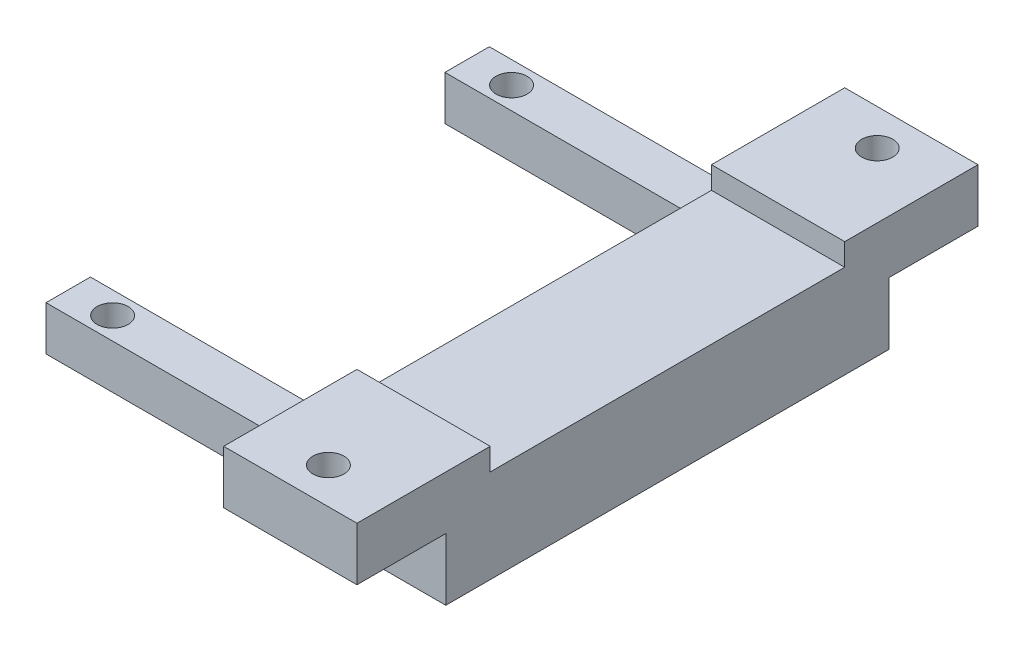
ISO-10303-21;
HEADER;
FILE_DESCRIPTION(('STEP AP214'),'2;1');
FILE_NAME('part.step','',(''),(''),'','','');
FILE_SCHEMA(('AUTOMOTIVE_DESIGN { 1 0 10303 214 1 1 1 1 }'));
ENDSEC;
DATA;
#1=APPLICATION_CONTEXT('core data for automotive mechanical design processes');
#2=APPLICATION_PROTOCOL_DEFINITION('international standard','automotive_design',2000,#1);
#3=PRODUCT_CONTEXT('',#1,'mechanical');
#4=PRODUCT('Part','Part','',(#3));
#5=PRODUCT_RELATED_PRODUCT_CATEGORY('part','',(#4));
#6=PRODUCT_DEFINITION_FORMATION('','',#4);
#7=PRODUCT_DEFINITION_CONTEXT('part definition',#1,'design');
#8=PRODUCT_DEFINITION('design','',#6,#7);
#9=PRODUCT_DEFINITION_SHAPE('','',#8);
#10=(LENGTH_UNIT() NAMED_UNIT(*) SI_UNIT(.MILLI.,.METRE.));
#11=(NAMED_UNIT(*) PLANE_ANGLE_UNIT() SI_UNIT($,.RADIAN.));
#12=(NAMED_UNIT(*) SI_UNIT($,.STERADIAN.) SOLID_ANGLE_UNIT());
#13=UNCERTAINTY_MEASURE_WITH_UNIT(LENGTH_MEASURE(1.E-05),#10,'distance_accuracy_value','');
#14=(GEOMETRIC_REPRESENTATION_CONTEXT(3) GLOBAL_UNCERTAINTY_ASSIGNED_CONTEXT((#13)) GLOBAL_UNIT_ASSIGNED_CONTEXT((#10,
#11,#12)) REPRESENTATION_CONTEXT('',''));
#15=CARTESIAN_POINT('',(0.,0.,0.));
#16=DIRECTION('',(0.,0.,1.));
#17=DIRECTION('',(1.,0.,0.));
#18=AXIS2_PLACEMENT_3D('',#15,#16,#17);
#19=CARTESIAN_POINT('',(0.,13.,0.));
#20=DIRECTION('',(0.,-1.,0.));
#21=DIRECTION('',(0.,0.,-1.));
#22=AXIS2_PLACEMENT_3D('',#19,#20,#21);
#23=PLANE('',#22);
#24=CARTESIAN_POINT('',(7.72256481687533,13.,-30.8856889982669));
#25=DIRECTION('',(0.,1.,0.));
#26=DIRECTION('',(0.,0.,1.));
#27=AXIS2_PLACEMENT_3D('',#24,#25,#26);
#28=CIRCLE('',#27,1.75);
#29=CARTESIAN_POINT('',(7.72256481687533,13.,-29.1356889982669));
#30=VERTEX_POINT('',#29);
#31=EDGE_CURVE('E239',#30,#30,#28,.T.);
#32=ORIENTED_EDGE('',*,*,#31,.F.);
#33=EDGE_LOOP('',(#32));
#34=FACE_BOUND('',#33,.T.);
#35=DIRECTION('',(0.,0.,1.));
#36=VECTOR('',#35,1.);
#37=CARTESIAN_POINT('',(0.,13.,24.95));
#38=LINE('',#37,#36);
#39=CARTESIAN_POINT('',(0.,13.,-34.95));
#40=VERTEX_POINT('',#39);
#41=CARTESIAN_POINT('',(0.,13.,-19.95));
#42=VERTEX_POINT('',#41);
#43=EDGE_CURVE('E269',#40,#42,#38,.T.);
#44=ORIENTED_EDGE('',*,*,#43,.T.);
#45=DIRECTION('',(-1.,0.,0.));
#46=VECTOR('',#45,1.);
#47=CARTESIAN_POINT('',(0.,13.,-19.95));
#48=LINE('',#47,#46);
#49=CARTESIAN_POINT('',(15.,13.,-19.95));
#50=VERTEX_POINT('',#49);
#51=EDGE_CURVE('E195',#50,#42,#48,.T.);
#52=ORIENTED_EDGE('',*,*,#51,.F.);
#53=DIRECTION('',(0.,0.,-1.));
#54=VECTOR('',#53,1.);
#55=CARTESIAN_POINT('',(15.,13.,24.95));
#56=LINE('',#55,#54);
#57=CARTESIAN_POINT('',(15.,13.,-34.95));
#58=VERTEX_POINT('',#57);
#59=EDGE_CURVE('E273',#50,#58,#56,.T.);
#60=ORIENTED_EDGE('',*,*,#59,.T.);
#61=DIRECTION('',(1.,0.,0.));
#62=VECTOR('',#61,1.);
#63=CARTESIAN_POINT('',(15.,13.,-34.95));
#64=LINE('',#63,#62);
#65=EDGE_CURVE('E255',#40,#58,#64,.T.);
#66=ORIENTED_EDGE('',*,*,#65,.F.);
#67=EDGE_LOOP('',(#44,#52,#60,#66));
#68=FACE_BOUND('',#67,.T.);
#69=ADVANCED_FACE('F45',(#34,#68),#23,.F.);
#70=CARTESIAN_POINT('',(0.,2.,-24.95));
#71=DIRECTION('',(0.,0.,1.));
#72=DIRECTION('',(1.,0.,0.));
#73=AXIS2_PLACEMENT_3D('',#70,#71,#72);
#74=PLANE('',#73);
#75=DIRECTION('',(-1.,0.,0.));
#76=VECTOR('',#75,1.);
#77=CARTESIAN_POINT('',(15.,7.,-24.95));
#78=LINE('',#77,#76);
#79=CARTESIAN_POINT('',(15.,7.,-24.95));
#80=VERTEX_POINT('',#79);
#81=CARTESIAN_POINT('',(0.,7.,-24.95));
#82=VERTEX_POINT('',#81);
#83=EDGE_CURVE('E71',#80,#82,#78,.T.);
#84=ORIENTED_EDGE('',*,*,#83,.F.);
#85=DIRECTION('',(0.,-1.,0.));
#86=VECTOR('',#85,1.);
#87=CARTESIAN_POINT('',(15.,2.,-24.95));
#88=LINE('',#87,#86);
#89=CARTESIAN_POINT('',(15.,0.,-24.95));
#90=VERTEX_POINT('',#89);
#91=EDGE_CURVE('E382',#80,#90,#88,.T.);
#92=ORIENTED_EDGE('',*,*,#91,.T.);
#93=DIRECTION('',(-1.,0.,0.));
#94=VECTOR('',#93,1.);
#95=CARTESIAN_POINT('',(0.,0.,-24.95));
#96=LINE('',#95,#94);
#97=CARTESIAN_POINT('',(0.,0.,-24.95));
#98=VERTEX_POINT('',#97);
#99=EDGE_CURVE('E376',#90,#98,#96,.T.);
#100=ORIENTED_EDGE('',*,*,#99,.T.);
#101=DIRECTION('',(0.,-1.,0.));
#102=VECTOR('',#101,1.);
#103=CARTESIAN_POINT('',(0.,2.,-24.95));
#104=LINE('',#103,#102);
#105=CARTESIAN_POINT('',(0.,2.,-24.95));
#106=VERTEX_POINT('',#105);
#107=EDGE_CURVE('E363',#106,#98,#104,.T.);
#108=ORIENTED_EDGE('',*,*,#107,.F.);
#109=DIRECTION('',(-1.,0.,0.));
#110=VECTOR('',#109,1.);
#111=CARTESIAN_POINT('',(15.,2.,-24.95));
#112=LINE('',#111,#110);
#113=CARTESIAN_POINT('',(-30.,2.,-24.95));
#114=VERTEX_POINT('',#113);
#115=EDGE_CURVE('E319',#106,#114,#112,.T.);
#116=ORIENTED_EDGE('',*,*,#115,.T.);
#117=DIRECTION('',(0.,-1.,0.));
#118=VECTOR('',#117,1.);
#119=CARTESIAN_POINT('',(-30.,7.,-24.95));
#120=LINE('',#119,#118);
#121=CARTESIAN_POINT('',(-30.,7.,-24.95));
#122=VERTEX_POINT('',#121);
#123=EDGE_CURVE('E333',#122,#114,#120,.T.);
#124=ORIENTED_EDGE('',*,*,#123,.F.);
#125=DIRECTION('',(-1.,0.,0.));
#126=VECTOR('',#125,1.);
#127=CARTESIAN_POINT('',(15.,7.,-24.95));
#128=LINE('',#127,#126);
#129=EDGE_CURVE('E347',#82,#122,#128,.T.);
#130=ORIENTED_EDGE('',*,*,#129,.F.);
#131=EDGE_LOOP('',(#84,#92,#100,#108,#116,#124,#130));
#132=FACE_BOUND('',#131,.T.);
#133=ADVANCED_FACE('F418',(#132),#74,.F.);
#134=CARTESIAN_POINT('',(15.,7.,-19.95));
#135=DIRECTION('',(0.,0.,-1.));
#136=DIRECTION('',(-1.,0.,0.));
#137=AXIS2_PLACEMENT_3D('',#134,#135,#136);
#138=PLANE('',#137);
#139=DIRECTION('',(0.,-1.,0.));
#140=VECTOR('',#139,1.);
#141=CARTESIAN_POINT('',(0.,7.,-19.95));
#142=LINE('',#141,#140);
#143=CARTESIAN_POINT('',(0.,7.,-19.95));
#144=VERTEX_POINT('',#143);
#145=CARTESIAN_POINT('',(0.,2.,-19.95));
#146=VERTEX_POINT('',#145);
#147=EDGE_CURVE('E282',#144,#146,#142,.T.);
#148=ORIENTED_EDGE('',*,*,#147,.F.);
#149=DIRECTION('',(1.,0.,0.));
#150=VECTOR('',#149,1.);
#151=CARTESIAN_POINT('',(15.,7.,-19.95));
#152=LINE('',#151,#150);
#153=CARTESIAN_POINT('',(-30.,7.,-19.95));
#154=VERTEX_POINT('',#153);
#155=EDGE_CURVE('E341',#154,#144,#152,.T.);
#156=ORIENTED_EDGE('',*,*,#155,.F.);
#157=DIRECTION('',(0.,-1.,0.));
#158=VECTOR('',#157,1.);
#159=CARTESIAN_POINT('',(-30.,7.,-19.95));
#160=LINE('',#159,#158);
#161=CARTESIAN_POINT('',(-30.,2.,-19.95));
#162=VERTEX_POINT('',#161);
#163=EDGE_CURVE('E337',#154,#162,#160,.T.);
#164=ORIENTED_EDGE('',*,*,#163,.T.);
#165=DIRECTION('',(1.,0.,0.));
#166=VECTOR('',#165,1.);
#167=CARTESIAN_POINT('',(15.,2.,-19.95));
#168=LINE('',#167,#166);
#169=EDGE_CURVE('E342',#162,#146,#168,.T.);
#170=ORIENTED_EDGE('',*,*,#169,.T.);
#171=EDGE_LOOP('',(#148,#156,#164,#170));
#172=FACE_BOUND('',#171,.T.);
#173=ADVANCED_FACE('F427',(#172),#138,.F.);
#174=CARTESIAN_POINT('',(0.,7.,0.));
#175=DIRECTION('',(0.,-1.,0.));
#176=DIRECTION('',(0.,0.,-1.));
#177=AXIS2_PLACEMENT_3D('',#174,#175,#176);
#178=PLANE('',#177);
#179=CARTESIAN_POINT('',(-25.,7.,-22.45));
#180=DIRECTION('',(0.,1.,0.));
#181=DIRECTION('',(0.,0.,-1.));
#182=AXIS2_PLACEMENT_3D('',#179,#180,#181);
#183=CIRCLE('',#182,1.75);
#184=CARTESIAN_POINT('',(-25.,7.,-24.2));
#185=VERTEX_POINT('',#184);
#186=EDGE_CURVE('E290',#185,#185,#183,.T.);
#187=ORIENTED_EDGE('',*,*,#186,.F.);
#188=EDGE_LOOP('',(#187));
#189=FACE_BOUND('',#188,.T.);
#190=DIRECTION('',(0.,0.,1.));
#191=VECTOR('',#190,1.);
#192=CARTESIAN_POINT('',(0.,7.,0.));
#193=LINE('',#192,#191);
#194=EDGE_CURVE('E286',#82,#144,#193,.T.);
#195=ORIENTED_EDGE('',*,*,#194,.F.);
#196=ORIENTED_EDGE('',*,*,#129,.T.);
#197=DIRECTION('',(0.,0.,1.));
#198=VECTOR('',#197,1.);
#199=CARTESIAN_POINT('',(-30.,7.,-24.95));
#200=LINE('',#199,#198);
#201=EDGE_CURVE('E355',#122,#154,#200,.T.);
#202=ORIENTED_EDGE('',*,*,#201,.T.);
#203=ORIENTED_EDGE('',*,*,#155,.T.);
#204=EDGE_LOOP('',(#195,#196,#202,#203));
#205=FACE_BOUND('',#204,.T.);
#206=ADVANCED_FACE('F479',(#189,#205),#178,.F.);
#207=CARTESIAN_POINT('',(15.,7.,19.95));
#208=DIRECTION('',(0.,0.,1.));
#209=DIRECTION('',(1.,0.,0.));
#210=AXIS2_PLACEMENT_3D('',#207,#208,#209);
#211=PLANE('',#210);
#212=DIRECTION('',(0.,1.,0.));
#213=VECTOR('',#212,1.);
#214=CARTESIAN_POINT('',(0.,7.,19.95));
#215=LINE('',#214,#213);
#216=CARTESIAN_POINT('',(0.,2.,19.95));
#217=VERTEX_POINT('',#216);
#218=CARTESIAN_POINT('',(0.,7.,19.95));
#219=VERTEX_POINT('',#218);
#220=EDGE_CURVE('E278',#217,#219,#215,.T.);
#221=ORIENTED_EDGE('',*,*,#220,.F.);
#222=DIRECTION('',(-1.,0.,0.));
#223=VECTOR('',#222,1.);
#224=CARTESIAN_POINT('',(15.,2.,19.95));
#225=LINE('',#224,#223);
#226=CARTESIAN_POINT('',(-30.,2.,19.95));
#227=VERTEX_POINT('',#226);
#228=EDGE_CURVE('E315',#217,#227,#225,.T.);
#229=ORIENTED_EDGE('',*,*,#228,.T.);
#230=DIRECTION('',(0.,-1.,0.));
#231=VECTOR('',#230,1.);
#232=CARTESIAN_POINT('',(-30.,7.,19.95));
#233=LINE('',#232,#231);
#234=CARTESIAN_POINT('',(-30.,7.,19.95));
#235=VERTEX_POINT('',#234);
#236=EDGE_CURVE('E328',#235,#227,#233,.T.);
#237=ORIENTED_EDGE('',*,*,#236,.F.);
#238=DIRECTION('',(-1.,0.,0.));
#239=VECTOR('',#238,1.);
#240=CARTESIAN_POINT('',(15.,7.,19.95));
#241=LINE('',#240,#239);
#242=EDGE_CURVE('E303',#219,#235,#241,.T.);
#243=ORIENTED_EDGE('',*,*,#242,.F.);
#244=EDGE_LOOP('',(#221,#229,#237,#243));
#245=FACE_BOUND('',#244,.T.);
#246=ADVANCED_FACE('F505',(#245),#211,.F.);
#247=CARTESIAN_POINT('',(0.,7.,0.));
#248=DIRECTION('',(0.,1.,0.));
#249=DIRECTION('',(0.,0.,1.));
#250=AXIS2_PLACEMENT_3D('',#247,#248,#249);
#251=PLANE('',#250);
#252=CARTESIAN_POINT('',(-25.,7.,22.45));
#253=DIRECTION('',(0.,1.,0.));
#254=DIRECTION('',(0.,0.,1.));
#255=AXIS2_PLACEMENT_3D('',#252,#253,#254);
#256=CIRCLE('',#255,1.75);
#257=CARTESIAN_POINT('',(-25.,7.,24.2));
#258=VERTEX_POINT('',#257);
#259=EDGE_CURVE('E291',#258,#258,#256,.T.);
#260=ORIENTED_EDGE('',*,*,#259,.F.);
#261=EDGE_LOOP('',(#260));
#262=FACE_BOUND('',#261,.T.);
#263=DIRECTION('',(1.,0.,0.));
#264=VECTOR('',#263,1.);
#265=CARTESIAN_POINT('',(15.,7.,24.95));
#266=LINE('',#265,#264);
#267=CARTESIAN_POINT('',(-30.,7.,24.95));
#268=VERTEX_POINT('',#267);
#269=CARTESIAN_POINT('',(0.,7.,24.95));
#270=VERTEX_POINT('',#269);
#271=EDGE_CURVE('E310',#268,#270,#266,.T.);
#272=ORIENTED_EDGE('',*,*,#271,.T.);
#273=DIRECTION('',(0.,0.,-1.));
#274=VECTOR('',#273,1.);
#275=CARTESIAN_POINT('',(0.,7.,0.));
#276=LINE('',#275,#274);
#277=EDGE_CURVE('E11',#270,#219,#276,.T.);
#278=ORIENTED_EDGE('',*,*,#277,.T.);
#279=ORIENTED_EDGE('',*,*,#242,.T.);
#280=DIRECTION('',(0.,0.,1.));
#281=VECTOR('',#280,1.);
#282=CARTESIAN_POINT('',(-30.,7.,24.95));
#283=LINE('',#282,#281);
#284=EDGE_CURVE('E306',#235,#268,#283,.T.);
#285=ORIENTED_EDGE('',*,*,#284,.T.);
#286=EDGE_LOOP('',(#272,#278,#279,#285));
#287=FACE_BOUND('',#286,.T.);
#288=ADVANCED_FACE('F508',(#262,#287),#251,.T.);
#289=CARTESIAN_POINT('',(0.,2.,24.95));
#290=DIRECTION('',(1.,0.,0.));
#291=DIRECTION('',(0.,0.,-1.));
#292=AXIS2_PLACEMENT_3D('',#289,#290,#291);
#293=PLANE('',#292);
#294=DIRECTION('',(0.,0.,1.));
#295=VECTOR('',#294,1.);
#296=CARTESIAN_POINT('',(0.,10.5,-19.95));
#297=LINE('',#296,#295);
#298=CARTESIAN_POINT('',(0.,10.5,-19.95));
#299=VERTEX_POINT('',#298);
#300=CARTESIAN_POINT('',(0.,10.5,19.95));
#301=VERTEX_POINT('',#300);
#302=EDGE_CURVE('E185',#299,#301,#297,.T.);
#303=ORIENTED_EDGE('',*,*,#302,.F.);
#304=DIRECTION('',(0.,1.,0.));
#305=VECTOR('',#304,1.);
#306=CARTESIAN_POINT('',(0.,10.5,-19.95));
#307=LINE('',#306,#305);
#308=EDGE_CURVE('E213',#299,#42,#307,.T.);
#309=ORIENTED_EDGE('',*,*,#308,.T.);
#310=ORIENTED_EDGE('',*,*,#43,.F.);
#311=DIRECTION('',(0.,1.,0.));
#312=VECTOR('',#311,1.);
#313=CARTESIAN_POINT('',(0.,13.,-34.95));
#314=LINE('',#313,#312);
#315=CARTESIAN_POINT('',(0.,7.,-34.95));
#316=VERTEX_POINT('',#315);
#317=EDGE_CURVE('E251',#316,#40,#314,.T.);
#318=ORIENTED_EDGE('',*,*,#317,.F.);
#319=DIRECTION('',(0.,0.,1.));
#320=VECTOR('',#319,1.);
#321=CARTESIAN_POINT('',(0.,7.,-34.95));
#322=LINE('',#321,#320);
#323=EDGE_CURVE('E259',#316,#82,#322,.T.);
#324=ORIENTED_EDGE('',*,*,#323,.T.);
#325=ORIENTED_EDGE('',*,*,#194,.T.);
#326=ORIENTED_EDGE('',*,*,#147,.T.);
#327=DIRECTION('',(0.,0.,1.));
#328=VECTOR('',#327,1.);
#329=CARTESIAN_POINT('',(0.,2.,24.95));
#330=LINE('',#329,#328);
#331=EDGE_CURVE('E360',#106,#146,#330,.T.);
#332=ORIENTED_EDGE('',*,*,#331,.F.);
#333=ORIENTED_EDGE('',*,*,#107,.T.);
#334=DIRECTION('',(0.,0.,1.));
#335=VECTOR('',#334,1.);
#336=CARTESIAN_POINT('',(0.,0.,24.95));
#337=LINE('',#336,#335);
#338=CARTESIAN_POINT('',(0.,0.,24.95));
#339=VERTEX_POINT('',#338);
#340=EDGE_CURVE('E332',#98,#339,#337,.T.);
#341=ORIENTED_EDGE('',*,*,#340,.T.);
#342=DIRECTION('',(0.,-1.,0.));
#343=VECTOR('',#342,1.);
#344=CARTESIAN_POINT('',(0.,2.,24.95));
#345=LINE('',#344,#343);
#346=CARTESIAN_POINT('',(0.,2.,24.95));
#347=VERTEX_POINT('',#346);
#348=EDGE_CURVE('E55',#347,#339,#345,.T.);
#349=ORIENTED_EDGE('',*,*,#348,.F.);
#350=EDGE_CURVE('E364',#217,#347,#330,.T.);
#351=ORIENTED_EDGE('',*,*,#350,.F.);
#352=ORIENTED_EDGE('',*,*,#220,.T.);
#353=ORIENTED_EDGE('',*,*,#277,.F.);
#354=DIRECTION('',(0.,0.,-1.));
#355=VECTOR('',#354,1.);
#356=CARTESIAN_POINT('',(0.,7.,34.95));
#357=LINE('',#356,#355);
#358=CARTESIAN_POINT('',(0.,7.,34.95));
#359=VERTEX_POINT('',#358);
#360=EDGE_CURVE('E236',#359,#270,#357,.T.);
#361=ORIENTED_EDGE('',*,*,#360,.F.);
#362=DIRECTION('',(0.,1.,0.));
#363=VECTOR('',#362,1.);
#364=CARTESIAN_POINT('',(0.,13.,34.95));
#365=LINE('',#364,#363);
#366=CARTESIAN_POINT('',(0.,13.,34.95));
#367=VERTEX_POINT('',#366);
#368=EDGE_CURVE('E223',#359,#367,#365,.T.);
#369=ORIENTED_EDGE('',*,*,#368,.T.);
#370=CARTESIAN_POINT('',(0.,13.,19.95));
#371=VERTEX_POINT('',#370);
#372=EDGE_CURVE('E199',#371,#367,#38,.T.);
#373=ORIENTED_EDGE('',*,*,#372,.F.);
#374=DIRECTION('',(0.,1.,0.));
#375=VECTOR('',#374,1.);
#376=CARTESIAN_POINT('',(0.,10.5,19.95));
#377=LINE('',#376,#375);
#378=EDGE_CURVE('E63',#301,#371,#377,.T.);
#379=ORIENTED_EDGE('',*,*,#378,.F.);
#380=EDGE_LOOP('',(#303,#309,#310,#318,#324,#325,#326,#332,#333,#341,#349,#351,#352,#353,#361,
#369,#373,#379));
#381=FACE_BOUND('',#380,.T.);
#382=ADVANCED_FACE('F47',(#381),#293,.F.);
#383=CARTESIAN_POINT('',(0.,2.,24.95));
#384=DIRECTION('',(0.,0.,-1.));
#385=DIRECTION('',(-1.,0.,0.));
#386=AXIS2_PLACEMENT_3D('',#383,#384,#385);
#387=PLANE('',#386);
#388=DIRECTION('',(0.,-1.,0.));
#389=VECTOR('',#388,1.);
#390=CARTESIAN_POINT('',(15.,2.,24.95));
#391=LINE('',#390,#389);
#392=CARTESIAN_POINT('',(15.,7.,24.95));
#393=VERTEX_POINT('',#392);
#394=CARTESIAN_POINT('',(15.,0.,24.95));
#395=VERTEX_POINT('',#394);
#396=EDGE_CURVE('E385',#393,#395,#391,.T.);
#397=ORIENTED_EDGE('',*,*,#396,.F.);
#398=DIRECTION('',(-1.,0.,0.));
#399=VECTOR('',#398,1.);
#400=CARTESIAN_POINT('',(15.,7.,24.95));
#401=LINE('',#400,#399);
#402=EDGE_CURVE('E219',#393,#270,#401,.T.);
#403=ORIENTED_EDGE('',*,*,#402,.T.);
#404=ORIENTED_EDGE('',*,*,#271,.F.);
#405=DIRECTION('',(0.,-1.,0.));
#406=VECTOR('',#405,1.);
#407=CARTESIAN_POINT('',(-30.,7.,24.95));
#408=LINE('',#407,#406);
#409=CARTESIAN_POINT('',(-30.,2.,24.95));
#410=VERTEX_POINT('',#409);
#411=EDGE_CURVE('E314',#268,#410,#408,.T.);
#412=ORIENTED_EDGE('',*,*,#411,.T.);
#413=DIRECTION('',(1.,0.,0.));
#414=VECTOR('',#413,1.);
#415=CARTESIAN_POINT('',(15.,2.,24.95));
#416=LINE('',#415,#414);
#417=EDGE_CURVE('E307',#410,#347,#416,.T.);
#418=ORIENTED_EDGE('',*,*,#417,.T.);
#419=ORIENTED_EDGE('',*,*,#348,.T.);
#420=DIRECTION('',(1.,0.,0.));
#421=VECTOR('',#420,1.);
#422=CARTESIAN_POINT('',(0.,0.,24.95));
#423=LINE('',#422,#421);
#424=EDGE_CURVE('E368',#339,#395,#423,.T.);
#425=ORIENTED_EDGE('',*,*,#424,.T.);
#426=EDGE_LOOP('',(#397,#403,#404,#412,#418,#419,#425));
#427=FACE_BOUND('',#426,.T.);
#428=ADVANCED_FACE('F461',(#427),#387,.F.);
#429=CARTESIAN_POINT('',(15.,2.,24.95));
#430=DIRECTION('',(-1.,0.,0.));
#431=DIRECTION('',(0.,0.,1.));
#432=AXIS2_PLACEMENT_3D('',#429,#430,#431);
#433=PLANE('',#432);
#434=ORIENTED_EDGE('',*,*,#59,.F.);
#435=DIRECTION('',(0.,1.,0.));
#436=VECTOR('',#435,1.);
#437=CARTESIAN_POINT('',(15.,10.5,-19.95));
#438=LINE('',#437,#436);
#439=CARTESIAN_POINT('',(15.,10.5,-19.95));
#440=VERTEX_POINT('',#439);
#441=EDGE_CURVE('E204',#440,#50,#438,.T.);
#442=ORIENTED_EDGE('',*,*,#441,.F.);
#443=DIRECTION('',(0.,0.,-1.));
#444=VECTOR('',#443,1.);
#445=CARTESIAN_POINT('',(15.,10.5,-19.95));
#446=LINE('',#445,#444);
#447=CARTESIAN_POINT('',(15.,10.5,19.95));
#448=VERTEX_POINT('',#447);
#449=EDGE_CURVE('E184',#448,#440,#446,.T.);
#450=ORIENTED_EDGE('',*,*,#449,.F.);
#451=DIRECTION('',(0.,1.,0.));
#452=VECTOR('',#451,1.);
#453=CARTESIAN_POINT('',(15.,10.5,19.95));
#454=LINE('',#453,#452);
#455=CARTESIAN_POINT('',(15.,13.,19.95));
#456=VERTEX_POINT('',#455);
#457=EDGE_CURVE('E180',#448,#456,#454,.T.);
#458=ORIENTED_EDGE('',*,*,#457,.T.);
#459=CARTESIAN_POINT('',(15.,13.,34.95));
#460=VERTEX_POINT('',#459);
#461=EDGE_CURVE('E274',#460,#456,#56,.T.);
#462=ORIENTED_EDGE('',*,*,#461,.F.);
#463=DIRECTION('',(0.,-1.,0.));
#464=VECTOR('',#463,1.);
#465=CARTESIAN_POINT('',(15.,13.,34.95));
#466=LINE('',#465,#464);
#467=CARTESIAN_POINT('',(15.,7.,34.95));
#468=VERTEX_POINT('',#467);
#469=EDGE_CURVE('E214',#460,#468,#466,.T.);
#470=ORIENTED_EDGE('',*,*,#469,.T.);
#471=DIRECTION('',(0.,0.,-1.));
#472=VECTOR('',#471,1.);
#473=CARTESIAN_POINT('',(15.,7.,34.95));
#474=LINE('',#473,#472);
#475=EDGE_CURVE('E230',#468,#393,#474,.T.);
#476=ORIENTED_EDGE('',*,*,#475,.T.);
#477=ORIENTED_EDGE('',*,*,#396,.T.);
#478=DIRECTION('',(0.,0.,-1.));
#479=VECTOR('',#478,1.);
#480=CARTESIAN_POINT('',(15.,0.,24.95));
#481=LINE('',#480,#479);
#482=EDGE_CURVE('E372',#395,#90,#481,.T.);
#483=ORIENTED_EDGE('',*,*,#482,.T.);
#484=ORIENTED_EDGE('',*,*,#91,.F.);
#485=DIRECTION('',(0.,0.,1.));
#486=VECTOR('',#485,1.);
#487=CARTESIAN_POINT('',(15.,7.,-34.95));
#488=LINE('',#487,#486);
#489=CARTESIAN_POINT('',(15.,7.,-34.95));
#490=VERTEX_POINT('',#489);
#491=EDGE_CURVE('E265',#490,#80,#488,.T.);
#492=ORIENTED_EDGE('',*,*,#491,.F.);
#493=DIRECTION('',(0.,-1.,0.));
#494=VECTOR('',#493,1.);
#495=CARTESIAN_POINT('',(15.,13.,-34.95));
#496=LINE('',#495,#494);
#497=EDGE_CURVE('E244',#58,#490,#496,.T.);
#498=ORIENTED_EDGE('',*,*,#497,.F.);
#499=EDGE_LOOP('',(#434,#442,#450,#458,#462,#470,#476,#477,#483,#484,#492,#498));
#500=FACE_BOUND('',#499,.T.);
#501=ADVANCED_FACE('F451',(#500),#433,.F.);
#502=CARTESIAN_POINT('',(0.,0.,0.));
#503=DIRECTION('',(0.,-1.,0.));
#504=DIRECTION('',(0.,0.,-1.));
#505=AXIS2_PLACEMENT_3D('',#502,#503,#504);
#506=PLANE('',#505);
#507=ORIENTED_EDGE('',*,*,#340,.F.);
#508=ORIENTED_EDGE('',*,*,#99,.F.);
#509=ORIENTED_EDGE('',*,*,#482,.F.);
#510=ORIENTED_EDGE('',*,*,#424,.F.);
#511=EDGE_LOOP('',(#507,#508,#509,#510));
#512=FACE_BOUND('',#511,.T.);
#513=ADVANCED_FACE('F464',(#512),#506,.T.);
#514=CARTESIAN_POINT('',(-30.,7.,-24.95));
#515=DIRECTION('',(1.,0.,0.));
#516=DIRECTION('',(0.,0.,-1.));
#517=AXIS2_PLACEMENT_3D('',#514,#515,#516);
#518=PLANE('',#517);
#519=DIRECTION('',(0.,0.,1.));
#520=VECTOR('',#519,1.);
#521=CARTESIAN_POINT('',(-30.,2.,-24.95));
#522=LINE('',#521,#520);
#523=EDGE_CURVE('E346',#114,#162,#522,.T.);
#524=ORIENTED_EDGE('',*,*,#523,.T.);
#525=ORIENTED_EDGE('',*,*,#163,.F.);
#526=ORIENTED_EDGE('',*,*,#201,.F.);
#527=ORIENTED_EDGE('',*,*,#123,.T.);
#528=EDGE_LOOP('',(#524,#525,#526,#527));
#529=FACE_BOUND('',#528,.T.);
#530=ADVANCED_FACE('F474',(#529),#518,.F.);
#531=CARTESIAN_POINT('',(0.,2.,0.));
#532=DIRECTION('',(0.,-1.,0.));
#533=DIRECTION('',(0.,0.,-1.));
#534=AXIS2_PLACEMENT_3D('',#531,#532,#533);
#535=PLANE('',#534);
#536=CARTESIAN_POINT('',(-25.,2.,-22.45));
#537=DIRECTION('',(0.,-1.,0.));
#538=DIRECTION('',(0.,0.,-1.));
#539=AXIS2_PLACEMENT_3D('',#536,#537,#538);
#540=CIRCLE('',#539,1.75);
#541=CARTESIAN_POINT('',(-25.,2.,-24.2));
#542=VERTEX_POINT('',#541);
#543=EDGE_CURVE('E302',#542,#542,#540,.T.);
#544=ORIENTED_EDGE('',*,*,#543,.F.);
#545=EDGE_LOOP('',(#544));
#546=FACE_BOUND('',#545,.T.);
#547=ORIENTED_EDGE('',*,*,#115,.F.);
#548=ORIENTED_EDGE('',*,*,#331,.T.);
#549=ORIENTED_EDGE('',*,*,#169,.F.);
#550=ORIENTED_EDGE('',*,*,#523,.F.);
#551=EDGE_LOOP('',(#547,#548,#549,#550));
#552=FACE_BOUND('',#551,.T.);
#553=ADVANCED_FACE('F470',(#546,#552),#535,.T.);
#554=CARTESIAN_POINT('',(0.,2.,0.));
#555=DIRECTION('',(0.,1.,0.));
#556=DIRECTION('',(0.,0.,1.));
#557=AXIS2_PLACEMENT_3D('',#554,#555,#556);
#558=PLANE('',#557);
#559=CARTESIAN_POINT('',(-25.,2.,22.45));
#560=DIRECTION('',(0.,1.,0.));
#561=DIRECTION('',(0.,0.,1.));
#562=AXIS2_PLACEMENT_3D('',#559,#560,#561);
#563=CIRCLE('',#562,1.75);
#564=CARTESIAN_POINT('',(-25.,2.,24.2));
#565=VERTEX_POINT('',#564);
#566=EDGE_CURVE('E295',#565,#565,#563,.T.);
#567=ORIENTED_EDGE('',*,*,#566,.T.);
#568=EDGE_LOOP('',(#567));
#569=FACE_BOUND('',#568,.T.);
#570=ORIENTED_EDGE('',*,*,#228,.F.);
#571=ORIENTED_EDGE('',*,*,#350,.T.);
#572=ORIENTED_EDGE('',*,*,#417,.F.);
#573=DIRECTION('',(0.,0.,1.));
#574=VECTOR('',#573,1.);
#575=CARTESIAN_POINT('',(-30.,2.,24.95));
#576=LINE('',#575,#574);
#577=EDGE_CURVE('E318',#227,#410,#576,.T.);
#578=ORIENTED_EDGE('',*,*,#577,.F.);
#579=EDGE_LOOP('',(#570,#571,#572,#578));
#580=FACE_BOUND('',#579,.T.);
#581=ADVANCED_FACE('F495',(#569,#580),#558,.F.);
#582=CARTESIAN_POINT('',(-30.,7.,24.95));
#583=DIRECTION('',(1.,0.,0.));
#584=DIRECTION('',(0.,0.,-1.));
#585=AXIS2_PLACEMENT_3D('',#582,#583,#584);
#586=PLANE('',#585);
#587=ORIENTED_EDGE('',*,*,#577,.T.);
#588=ORIENTED_EDGE('',*,*,#411,.F.);
#589=ORIENTED_EDGE('',*,*,#284,.F.);
#590=ORIENTED_EDGE('',*,*,#236,.T.);
#591=EDGE_LOOP('',(#587,#588,#589,#590));
#592=FACE_BOUND('',#591,.T.);
#593=ADVANCED_FACE('F501',(#592),#586,.F.);
#594=CARTESIAN_POINT('',(-25.,0.,22.45));
#595=DIRECTION('',(0.,1.,0.));
#596=DIRECTION('',(0.,0.,1.));
#597=AXIS2_PLACEMENT_3D('',#594,#595,#596);
#598=CYLINDRICAL_SURFACE('',#597,1.75);
#599=ORIENTED_EDGE('',*,*,#259,.T.);
#600=EDGE_LOOP('',(#599));
#601=FACE_BOUND('',#600,.T.);
#602=ORIENTED_EDGE('',*,*,#566,.F.);
#603=EDGE_LOOP('',(#602));
#604=FACE_BOUND('',#603,.T.);
#605=ADVANCED_FACE('F441',(#601,#604),#598,.F.);
#606=CARTESIAN_POINT('',(-25.,0.,-22.45));
#607=DIRECTION('',(0.,1.,0.));
#608=DIRECTION('',(0.,0.,1.));
#609=AXIS2_PLACEMENT_3D('',#606,#607,#608);
#610=CYLINDRICAL_SURFACE('',#609,1.75);
#611=ORIENTED_EDGE('',*,*,#543,.T.);
#612=EDGE_LOOP('',(#611));
#613=FACE_BOUND('',#612,.T.);
#614=ORIENTED_EDGE('',*,*,#186,.T.);
#615=EDGE_LOOP('',(#614));
#616=FACE_BOUND('',#615,.T.);
#617=ADVANCED_FACE('F434',(#613,#616),#610,.F.);
#618=CARTESIAN_POINT('',(7.72256481687533,13.,30.8856889982669));
#619=DIRECTION('',(0.,-1.,0.));
#620=DIRECTION('',(0.,0.,-1.));
#621=AXIS2_PLACEMENT_3D('',#618,#619,#620);
#622=CIRCLE('',#621,1.75);
#623=CARTESIAN_POINT('',(7.72256481687533,13.,29.1356889982669));
#624=VERTEX_POINT('',#623);
#625=EDGE_CURVE('E209',#624,#624,#622,.T.);
#626=ORIENTED_EDGE('',*,*,#625,.T.);
#627=EDGE_LOOP('',(#626));
#628=FACE_BOUND('',#627,.T.);
#629=ORIENTED_EDGE('',*,*,#461,.T.);
#630=DIRECTION('',(1.,0.,0.));
#631=VECTOR('',#630,1.);
#632=CARTESIAN_POINT('',(0.,13.,19.95));
#633=LINE('',#632,#631);
#634=EDGE_CURVE('E446',#371,#456,#633,.T.);
#635=ORIENTED_EDGE('',*,*,#634,.F.);
#636=ORIENTED_EDGE('',*,*,#372,.T.);
#637=DIRECTION('',(1.,0.,0.));
#638=VECTOR('',#637,1.);
#639=CARTESIAN_POINT('',(15.,13.,34.95));
#640=LINE('',#639,#638);
#641=EDGE_CURVE('E218',#367,#460,#640,.T.);
#642=ORIENTED_EDGE('',*,*,#641,.T.);
#643=EDGE_LOOP('',(#629,#635,#636,#642));
#644=FACE_BOUND('',#643,.T.);
#645=ADVANCED_FACE('F421',(#628,#644),#23,.F.);
#646=CARTESIAN_POINT('',(15.,7.,-34.95));
#647=DIRECTION('',(0.,1.,0.));
#648=DIRECTION('',(0.,0.,1.));
#649=AXIS2_PLACEMENT_3D('',#646,#647,#648);
#650=PLANE('',#649);
#651=CARTESIAN_POINT('',(7.72256481687533,7.,-30.8856889982669));
#652=DIRECTION('',(0.,1.,0.));
#653=DIRECTION('',(0.,0.,1.));
#654=AXIS2_PLACEMENT_3D('',#651,#652,#653);
#655=CIRCLE('',#654,1.75);
#656=CARTESIAN_POINT('',(7.72256481687533,7.,-29.1356889982669));
#657=VERTEX_POINT('',#656);
#658=EDGE_CURVE('E243',#657,#657,#655,.T.);
#659=ORIENTED_EDGE('',*,*,#658,.T.);
#660=EDGE_LOOP('',(#659));
#661=FACE_BOUND('',#660,.T.);
#662=ORIENTED_EDGE('',*,*,#83,.T.);
#663=ORIENTED_EDGE('',*,*,#323,.F.);
#664=DIRECTION('',(-1.,0.,0.));
#665=VECTOR('',#664,1.);
#666=CARTESIAN_POINT('',(15.,7.,-34.95));
#667=LINE('',#666,#665);
#668=EDGE_CURVE('E248',#490,#316,#667,.T.);
#669=ORIENTED_EDGE('',*,*,#668,.F.);
#670=ORIENTED_EDGE('',*,*,#491,.T.);
#671=EDGE_LOOP('',(#662,#663,#669,#670));
#672=FACE_BOUND('',#671,.T.);
#673=ADVANCED_FACE('F397',(#661,#672),#650,.F.);
#674=CARTESIAN_POINT('',(0.,0.,-34.95));
#675=DIRECTION('',(0.,0.,-1.));
#676=DIRECTION('',(-1.,0.,0.));
#677=AXIS2_PLACEMENT_3D('',#674,#675,#676);
#678=PLANE('',#677);
#679=ORIENTED_EDGE('',*,*,#497,.T.);
#680=ORIENTED_EDGE('',*,*,#668,.T.);
#681=ORIENTED_EDGE('',*,*,#317,.T.);
#682=ORIENTED_EDGE('',*,*,#65,.T.);
#683=EDGE_LOOP('',(#679,#680,#681,#682));
#684=FACE_BOUND('',#683,.T.);
#685=ADVANCED_FACE('F403',(#684),#678,.T.);
#686=CARTESIAN_POINT('',(7.72256481687533,0.,-30.8856889982669));
#687=DIRECTION('',(0.,1.,0.));
#688=DIRECTION('',(0.,0.,1.));
#689=AXIS2_PLACEMENT_3D('',#686,#687,#688);
#690=CYLINDRICAL_SURFACE('',#689,1.75);
#691=ORIENTED_EDGE('',*,*,#31,.T.);
#692=EDGE_LOOP('',(#691));
#693=FACE_BOUND('',#692,.T.);
#694=ORIENTED_EDGE('',*,*,#658,.F.);
#695=EDGE_LOOP('',(#694));
#696=FACE_BOUND('',#695,.T.);
#697=ADVANCED_FACE('F400',(#693,#696),#690,.F.);
#698=CARTESIAN_POINT('',(15.,7.,34.95));
#699=DIRECTION('',(0.,-1.,0.));
#700=DIRECTION('',(0.,0.,-1.));
#701=AXIS2_PLACEMENT_3D('',#698,#699,#700);
#702=PLANE('',#701);
#703=CARTESIAN_POINT('',(7.72256481687533,7.,30.8856889982669));
#704=DIRECTION('',(0.,-1.,0.));
#705=DIRECTION('',(0.,0.,-1.));
#706=AXIS2_PLACEMENT_3D('',#703,#704,#705);
#707=CIRCLE('',#706,1.75);
#708=CARTESIAN_POINT('',(7.72256481687533,7.,29.1356889982669));
#709=VERTEX_POINT('',#708);
#710=EDGE_CURVE('E49',#709,#709,#707,.F.);
#711=ORIENTED_EDGE('',*,*,#710,.T.);
#712=EDGE_LOOP('',(#711));
#713=FACE_BOUND('',#712,.T.);
#714=ORIENTED_EDGE('',*,*,#402,.F.);
#715=ORIENTED_EDGE('',*,*,#475,.F.);
#716=DIRECTION('',(-1.,0.,0.));
#717=VECTOR('',#716,1.);
#718=CARTESIAN_POINT('',(15.,7.,34.95));
#719=LINE('',#718,#717);
#720=EDGE_CURVE('E226',#468,#359,#719,.T.);
#721=ORIENTED_EDGE('',*,*,#720,.T.);
#722=ORIENTED_EDGE('',*,*,#360,.T.);
#723=EDGE_LOOP('',(#714,#715,#721,#722));
#724=FACE_BOUND('',#723,.T.);
#725=ADVANCED_FACE('F402',(#713,#724),#702,.T.);
#726=CARTESIAN_POINT('',(0.,0.,34.95));
#727=DIRECTION('',(0.,0.,1.));
#728=DIRECTION('',(-1.,0.,0.));
#729=AXIS2_PLACEMENT_3D('',#726,#727,#728);
#730=PLANE('',#729);
#731=ORIENTED_EDGE('',*,*,#469,.F.);
#732=ORIENTED_EDGE('',*,*,#641,.F.);
#733=ORIENTED_EDGE('',*,*,#368,.F.);
#734=ORIENTED_EDGE('',*,*,#720,.F.);
#735=EDGE_LOOP('',(#731,#732,#733,#734));
#736=FACE_BOUND('',#735,.T.);
#737=ADVANCED_FACE('F411',(#736),#730,.T.);
#738=CARTESIAN_POINT('',(7.72256481687533,0.,30.8856889982669));
#739=DIRECTION('',(0.,1.,0.));
#740=DIRECTION('',(0.,0.,1.));
#741=AXIS2_PLACEMENT_3D('',#738,#739,#740);
#742=CYLINDRICAL_SURFACE('',#741,1.75);
#743=ORIENTED_EDGE('',*,*,#710,.F.);
#744=EDGE_LOOP('',(#743));
#745=FACE_BOUND('',#744,.T.);
#746=ORIENTED_EDGE('',*,*,#625,.F.);
#747=EDGE_LOOP('',(#746));
#748=FACE_BOUND('',#747,.T.);
#749=ADVANCED_FACE('F551',(#745,#748),#742,.F.);
#750=CARTESIAN_POINT('',(0.,10.5,-19.95));
#751=DIRECTION('',(0.,0.,-1.));
#752=DIRECTION('',(-1.,0.,0.));
#753=AXIS2_PLACEMENT_3D('',#750,#751,#752);
#754=PLANE('',#753);
#755=ORIENTED_EDGE('',*,*,#51,.T.);
#756=ORIENTED_EDGE('',*,*,#308,.F.);
#757=DIRECTION('',(-1.,0.,0.));
#758=VECTOR('',#757,1.);
#759=CARTESIAN_POINT('',(0.,10.5,-19.95));
#760=LINE('',#759,#758);
#761=EDGE_CURVE('E191',#440,#299,#760,.T.);
#762=ORIENTED_EDGE('',*,*,#761,.F.);
#763=ORIENTED_EDGE('',*,*,#441,.T.);
#764=EDGE_LOOP('',(#755,#756,#762,#763));
#765=FACE_BOUND('',#764,.T.);
#766=ADVANCED_FACE('F558',(#765),#754,.F.);
#767=CARTESIAN_POINT('',(0.,10.5,19.95));
#768=DIRECTION('',(0.,0.,1.));
#769=DIRECTION('',(1.,0.,0.));
#770=AXIS2_PLACEMENT_3D('',#767,#768,#769);
#771=PLANE('',#770);
#772=ORIENTED_EDGE('',*,*,#634,.T.);
#773=ORIENTED_EDGE('',*,*,#457,.F.);
#774=DIRECTION('',(1.,0.,0.));
#775=VECTOR('',#774,1.);
#776=CARTESIAN_POINT('',(0.,10.5,19.95));
#777=LINE('',#776,#775);
#778=EDGE_CURVE('E176',#301,#448,#777,.T.);
#779=ORIENTED_EDGE('',*,*,#778,.F.);
#780=ORIENTED_EDGE('',*,*,#378,.T.);
#781=EDGE_LOOP('',(#772,#773,#779,#780));
#782=FACE_BOUND('',#781,.T.);
#783=ADVANCED_FACE('F178',(#782),#771,.F.);
#784=CARTESIAN_POINT('',(0.,10.5,0.));
#785=DIRECTION('',(0.,1.,0.));
#786=DIRECTION('',(0.,0.,1.));
#787=AXIS2_PLACEMENT_3D('',#784,#785,#786);
#788=PLANE('',#787);
#789=ORIENTED_EDGE('',*,*,#302,.T.);
#790=ORIENTED_EDGE('',*,*,#778,.T.);
#791=ORIENTED_EDGE('',*,*,#449,.T.);
#792=ORIENTED_EDGE('',*,*,#761,.T.);
#793=EDGE_LOOP('',(#789,#790,#791,#792));
#794=FACE_BOUND('',#793,.T.);
#795=ADVANCED_FACE('F189',(#794),#788,.T.);
#796=CLOSED_SHELL('',(#69,#133,#173,#206,#246,#288,#382,#428,#501,#513,#530,#553,#581,#593,#605,
#617,#645,#673,#685,#697,#725,#737,#749,#766,#783,#795));
#797=MANIFOLD_SOLID_BREP('B2',#796);
#798=ADVANCED_BREP_SHAPE_REPRESENTATION('',(#18,#797),#14);
#799=SHAPE_DEFINITION_REPRESENTATION(#9,#798);
ENDSEC;
END-ISO-10303-21;
